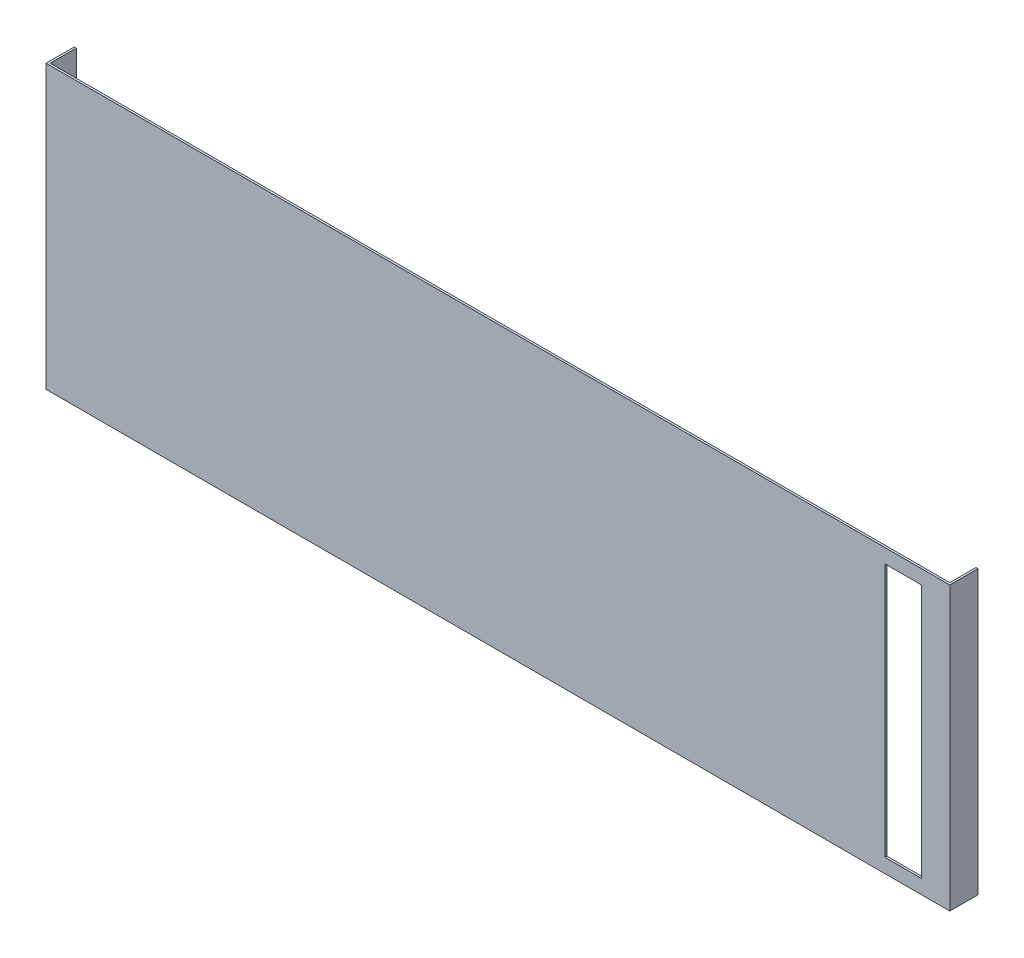
ISO-10303-21;
HEADER;
FILE_DESCRIPTION(('STEP AP214'),'2;1');
FILE_NAME('part.step','',(''),(''),'','','');
FILE_SCHEMA(('AUTOMOTIVE_DESIGN { 1 0 10303 214 1 1 1 1 }'));
ENDSEC;
DATA;
#1=APPLICATION_CONTEXT('core data for automotive mechanical design processes');
#2=APPLICATION_PROTOCOL_DEFINITION('international standard','automotive_design',2000,#1);
#3=PRODUCT_CONTEXT('',#1,'mechanical');
#4=PRODUCT('Part','Part','',(#3));
#5=PRODUCT_RELATED_PRODUCT_CATEGORY('part','',(#4));
#6=PRODUCT_DEFINITION_FORMATION('','',#4);
#7=PRODUCT_DEFINITION_CONTEXT('part definition',#1,'design');
#8=PRODUCT_DEFINITION('design','',#6,#7);
#9=PRODUCT_DEFINITION_SHAPE('','',#8);
#10=(LENGTH_UNIT() NAMED_UNIT(*) SI_UNIT(.MILLI.,.METRE.));
#11=(NAMED_UNIT(*) PLANE_ANGLE_UNIT() SI_UNIT($,.RADIAN.));
#12=(NAMED_UNIT(*) SI_UNIT($,.STERADIAN.) SOLID_ANGLE_UNIT());
#13=UNCERTAINTY_MEASURE_WITH_UNIT(LENGTH_MEASURE(1.E-05),#10,'distance_accuracy_value','');
#14=(GEOMETRIC_REPRESENTATION_CONTEXT(3) GLOBAL_UNCERTAINTY_ASSIGNED_CONTEXT((#13)) GLOBAL_UNIT_ASSIGNED_CONTEXT((#10,
#11,#12)) REPRESENTATION_CONTEXT('',''));
#15=CARTESIAN_POINT('',(0.,0.,0.));
#16=DIRECTION('',(0.,0.,1.));
#17=DIRECTION('',(1.,0.,0.));
#18=AXIS2_PLACEMENT_3D('',#15,#16,#17);
#19=CARTESIAN_POINT('',(670.,320.,40.));
#20=DIRECTION('',(0.,0.,-1.));
#21=DIRECTION('',(-1.,0.,0.));
#22=AXIS2_PLACEMENT_3D('',#19,#20,#21);
#23=PLANE('',#22);
#24=DIRECTION('',(1.,0.,0.));
#25=VECTOR('',#24,1.);
#26=CARTESIAN_POINT('',(670.,120.,40.));
#27=LINE('',#26,#25);
#28=CARTESIAN_POINT('',(30.,120.,40.));
#29=VERTEX_POINT('',#28);
#30=CARTESIAN_POINT('',(670.,120.,40.));
#31=VERTEX_POINT('',#30);
#32=EDGE_CURVE('E141',#29,#31,#27,.T.);
#33=ORIENTED_EDGE('',*,*,#32,.T.);
#34=DIRECTION('',(0.,-1.,0.));
#35=VECTOR('',#34,1.);
#36=CARTESIAN_POINT('',(670.,320.,40.));
#37=LINE('',#36,#35);
#38=CARTESIAN_POINT('',(670.,320.,40.));
#39=VERTEX_POINT('',#38);
#40=EDGE_CURVE('E200',#39,#31,#37,.T.);
#41=ORIENTED_EDGE('',*,*,#40,.F.);
#42=DIRECTION('',(1.,0.,0.));
#43=VECTOR('',#42,1.);
#44=CARTESIAN_POINT('',(670.,320.,40.));
#45=LINE('',#44,#43);
#46=CARTESIAN_POINT('',(30.,320.,40.));
#47=VERTEX_POINT('',#46);
#48=EDGE_CURVE('E149',#47,#39,#45,.T.);
#49=ORIENTED_EDGE('',*,*,#48,.F.);
#50=DIRECTION('',(0.,-1.,0.));
#51=VECTOR('',#50,1.);
#52=CARTESIAN_POINT('',(30.,320.,40.));
#53=LINE('',#52,#51);
#54=EDGE_CURVE('E166',#47,#29,#53,.T.);
#55=ORIENTED_EDGE('',*,*,#54,.T.);
#56=EDGE_LOOP('',(#33,#41,#49,#55));
#57=FACE_BOUND('',#56,.T.);
#58=DIRECTION('',(0.,-1.,0.));
#59=VECTOR('',#58,1.);
#60=CARTESIAN_POINT('',(624.,320.,40.));
#61=LINE('',#60,#59);
#62=CARTESIAN_POINT('',(624.,310.,40.));
#63=VERTEX_POINT('',#62);
#64=CARTESIAN_POINT('',(624.,130.,40.));
#65=VERTEX_POINT('',#64);
#66=EDGE_CURVE('E134',#63,#65,#61,.T.);
#67=ORIENTED_EDGE('',*,*,#66,.F.);
#68=DIRECTION('',(-1.,0.,0.));
#69=VECTOR('',#68,1.);
#70=CARTESIAN_POINT('',(670.,310.,40.));
#71=LINE('',#70,#69);
#72=CARTESIAN_POINT('',(650.,310.,40.));
#73=VERTEX_POINT('',#72);
#74=EDGE_CURVE('E123',#73,#63,#71,.T.);
#75=ORIENTED_EDGE('',*,*,#74,.F.);
#76=DIRECTION('',(0.,1.,0.));
#77=VECTOR('',#76,1.);
#78=CARTESIAN_POINT('',(650.,320.,40.));
#79=LINE('',#78,#77);
#80=CARTESIAN_POINT('',(650.,130.,40.));
#81=VERTEX_POINT('',#80);
#82=EDGE_CURVE('E128',#81,#73,#79,.T.);
#83=ORIENTED_EDGE('',*,*,#82,.F.);
#84=DIRECTION('',(1.,0.,0.));
#85=VECTOR('',#84,1.);
#86=CARTESIAN_POINT('',(670.,130.,40.));
#87=LINE('',#86,#85);
#88=EDGE_CURVE('E140',#65,#81,#87,.T.);
#89=ORIENTED_EDGE('',*,*,#88,.F.);
#90=EDGE_LOOP('',(#67,#75,#83,#89));
#91=FACE_BOUND('',#90,.T.);
#92=ADVANCED_FACE('F39',(#57,#91),#23,.F.);
#93=CARTESIAN_POINT('',(31.5,320.,38.5));
#94=DIRECTION('',(0.,0.,1.));
#95=DIRECTION('',(1.,0.,0.));
#96=AXIS2_PLACEMENT_3D('',#93,#94,#95);
#97=PLANE('',#96);
#98=DIRECTION('',(-1.,0.,0.));
#99=VECTOR('',#98,1.);
#100=CARTESIAN_POINT('',(31.5,120.,38.5));
#101=LINE('',#100,#99);
#102=CARTESIAN_POINT('',(668.5,120.,38.5));
#103=VERTEX_POINT('',#102);
#104=CARTESIAN_POINT('',(31.5,120.,38.5));
#105=VERTEX_POINT('',#104);
#106=EDGE_CURVE('E173',#103,#105,#101,.T.);
#107=ORIENTED_EDGE('',*,*,#106,.T.);
#108=DIRECTION('',(0.,-1.,0.));
#109=VECTOR('',#108,1.);
#110=CARTESIAN_POINT('',(31.5,320.,38.5));
#111=LINE('',#110,#109);
#112=CARTESIAN_POINT('',(31.5,320.,38.5));
#113=VERTEX_POINT('',#112);
#114=EDGE_CURVE('E188',#113,#105,#111,.T.);
#115=ORIENTED_EDGE('',*,*,#114,.F.);
#116=DIRECTION('',(-1.,0.,0.));
#117=VECTOR('',#116,1.);
#118=CARTESIAN_POINT('',(31.5,320.,38.5));
#119=LINE('',#118,#117);
#120=CARTESIAN_POINT('',(668.5,320.,38.5));
#121=VERTEX_POINT('',#120);
#122=EDGE_CURVE('E159',#121,#113,#119,.T.);
#123=ORIENTED_EDGE('',*,*,#122,.F.);
#124=DIRECTION('',(0.,-1.,0.));
#125=VECTOR('',#124,1.);
#126=CARTESIAN_POINT('',(668.5,320.,38.5));
#127=LINE('',#126,#125);
#128=EDGE_CURVE('E191',#121,#103,#127,.T.);
#129=ORIENTED_EDGE('',*,*,#128,.T.);
#130=EDGE_LOOP('',(#107,#115,#123,#129));
#131=FACE_BOUND('',#130,.T.);
#132=DIRECTION('',(0.,1.,0.));
#133=VECTOR('',#132,1.);
#134=CARTESIAN_POINT('',(624.,320.,38.5));
#135=LINE('',#134,#133);
#136=CARTESIAN_POINT('',(624.,130.,38.5));
#137=VERTEX_POINT('',#136);
#138=CARTESIAN_POINT('',(624.,310.,38.5));
#139=VERTEX_POINT('',#138);
#140=EDGE_CURVE('E11',#137,#139,#135,.T.);
#141=ORIENTED_EDGE('',*,*,#140,.F.);
#142=DIRECTION('',(-1.,0.,0.));
#143=VECTOR('',#142,1.);
#144=CARTESIAN_POINT('',(31.5,130.,38.5));
#145=LINE('',#144,#143);
#146=CARTESIAN_POINT('',(650.,130.,38.5));
#147=VERTEX_POINT('',#146);
#148=EDGE_CURVE('E46',#147,#137,#145,.T.);
#149=ORIENTED_EDGE('',*,*,#148,.F.);
#150=DIRECTION('',(0.,-1.,0.));
#151=VECTOR('',#150,1.);
#152=CARTESIAN_POINT('',(650.,320.,38.5));
#153=LINE('',#152,#151);
#154=CARTESIAN_POINT('',(650.,310.,38.5));
#155=VERTEX_POINT('',#154);
#156=EDGE_CURVE('E205',#155,#147,#153,.T.);
#157=ORIENTED_EDGE('',*,*,#156,.F.);
#158=DIRECTION('',(1.,0.,0.));
#159=VECTOR('',#158,1.);
#160=CARTESIAN_POINT('',(31.5,310.,38.5));
#161=LINE('',#160,#159);
#162=EDGE_CURVE('E203',#139,#155,#161,.T.);
#163=ORIENTED_EDGE('',*,*,#162,.F.);
#164=EDGE_LOOP('',(#141,#149,#157,#163));
#165=FACE_BOUND('',#164,.T.);
#166=ADVANCED_FACE('F215',(#131,#165),#97,.F.);
#167=CARTESIAN_POINT('',(670.,320.,20.));
#168=DIRECTION('',(-1.,0.,0.));
#169=DIRECTION('',(0.,0.,1.));
#170=AXIS2_PLACEMENT_3D('',#167,#168,#169);
#171=PLANE('',#170);
#172=DIRECTION('',(0.,0.,-1.));
#173=VECTOR('',#172,1.);
#174=CARTESIAN_POINT('',(670.,120.,20.));
#175=LINE('',#174,#173);
#176=CARTESIAN_POINT('',(670.,120.,20.));
#177=VERTEX_POINT('',#176);
#178=EDGE_CURVE('E144',#31,#177,#175,.T.);
#179=ORIENTED_EDGE('',*,*,#178,.T.);
#180=DIRECTION('',(0.,-1.,0.));
#181=VECTOR('',#180,1.);
#182=CARTESIAN_POINT('',(670.,320.,20.));
#183=LINE('',#182,#181);
#184=CARTESIAN_POINT('',(670.,320.,20.));
#185=VERTEX_POINT('',#184);
#186=EDGE_CURVE('E197',#185,#177,#183,.T.);
#187=ORIENTED_EDGE('',*,*,#186,.F.);
#188=DIRECTION('',(0.,0.,-1.));
#189=VECTOR('',#188,1.);
#190=CARTESIAN_POINT('',(670.,320.,20.));
#191=LINE('',#190,#189);
#192=EDGE_CURVE('E152',#39,#185,#191,.T.);
#193=ORIENTED_EDGE('',*,*,#192,.F.);
#194=ORIENTED_EDGE('',*,*,#40,.T.);
#195=EDGE_LOOP('',(#179,#187,#193,#194));
#196=FACE_BOUND('',#195,.T.);
#197=ADVANCED_FACE('F234',(#196),#171,.F.);
#198=CARTESIAN_POINT('',(668.5,320.,20.));
#199=DIRECTION('',(0.,0.,1.));
#200=DIRECTION('',(1.,0.,0.));
#201=AXIS2_PLACEMENT_3D('',#198,#199,#200);
#202=PLANE('',#201);
#203=DIRECTION('',(-1.,0.,0.));
#204=VECTOR('',#203,1.);
#205=CARTESIAN_POINT('',(668.5,120.,20.));
#206=LINE('',#205,#204);
#207=CARTESIAN_POINT('',(668.5,120.,20.));
#208=VERTEX_POINT('',#207);
#209=EDGE_CURVE('E169',#177,#208,#206,.T.);
#210=ORIENTED_EDGE('',*,*,#209,.T.);
#211=DIRECTION('',(0.,-1.,0.));
#212=VECTOR('',#211,1.);
#213=CARTESIAN_POINT('',(668.5,320.,20.));
#214=LINE('',#213,#212);
#215=CARTESIAN_POINT('',(668.5,320.,20.));
#216=VERTEX_POINT('',#215);
#217=EDGE_CURVE('E194',#216,#208,#214,.T.);
#218=ORIENTED_EDGE('',*,*,#217,.F.);
#219=DIRECTION('',(-1.,0.,0.));
#220=VECTOR('',#219,1.);
#221=CARTESIAN_POINT('',(668.5,320.,20.));
#222=LINE('',#221,#220);
#223=EDGE_CURVE('E155',#185,#216,#222,.T.);
#224=ORIENTED_EDGE('',*,*,#223,.F.);
#225=ORIENTED_EDGE('',*,*,#186,.T.);
#226=EDGE_LOOP('',(#210,#218,#224,#225));
#227=FACE_BOUND('',#226,.T.);
#228=ADVANCED_FACE('F273',(#227),#202,.F.);
#229=CARTESIAN_POINT('',(668.5,320.,38.5));
#230=DIRECTION('',(1.,0.,0.));
#231=DIRECTION('',(0.,0.,-1.));
#232=AXIS2_PLACEMENT_3D('',#229,#230,#231);
#233=PLANE('',#232);
#234=DIRECTION('',(0.,0.,1.));
#235=VECTOR('',#234,1.);
#236=CARTESIAN_POINT('',(668.5,120.,38.5));
#237=LINE('',#236,#235);
#238=EDGE_CURVE('E171',#208,#103,#237,.T.);
#239=ORIENTED_EDGE('',*,*,#238,.T.);
#240=ORIENTED_EDGE('',*,*,#128,.F.);
#241=DIRECTION('',(0.,0.,1.));
#242=VECTOR('',#241,1.);
#243=CARTESIAN_POINT('',(668.5,320.,38.5));
#244=LINE('',#243,#242);
#245=EDGE_CURVE('E157',#216,#121,#244,.T.);
#246=ORIENTED_EDGE('',*,*,#245,.F.);
#247=ORIENTED_EDGE('',*,*,#217,.T.);
#248=EDGE_LOOP('',(#239,#240,#246,#247));
#249=FACE_BOUND('',#248,.T.);
#250=ADVANCED_FACE('F270',(#249),#233,.F.);
#251=CARTESIAN_POINT('',(31.5,320.,20.));
#252=DIRECTION('',(-1.,0.,0.));
#253=DIRECTION('',(0.,0.,1.));
#254=AXIS2_PLACEMENT_3D('',#251,#252,#253);
#255=PLANE('',#254);
#256=DIRECTION('',(0.,0.,-1.));
#257=VECTOR('',#256,1.);
#258=CARTESIAN_POINT('',(31.5,120.,20.));
#259=LINE('',#258,#257);
#260=CARTESIAN_POINT('',(31.5,120.,20.));
#261=VERTEX_POINT('',#260);
#262=EDGE_CURVE('E175',#105,#261,#259,.T.);
#263=ORIENTED_EDGE('',*,*,#262,.T.);
#264=DIRECTION('',(0.,-1.,0.));
#265=VECTOR('',#264,1.);
#266=CARTESIAN_POINT('',(31.5,320.,20.));
#267=LINE('',#266,#265);
#268=CARTESIAN_POINT('',(31.5,320.,20.));
#269=VERTEX_POINT('',#268);
#270=EDGE_CURVE('E185',#269,#261,#267,.T.);
#271=ORIENTED_EDGE('',*,*,#270,.F.);
#272=DIRECTION('',(0.,0.,-1.));
#273=VECTOR('',#272,1.);
#274=CARTESIAN_POINT('',(31.5,320.,20.));
#275=LINE('',#274,#273);
#276=EDGE_CURVE('E161',#113,#269,#275,.T.);
#277=ORIENTED_EDGE('',*,*,#276,.F.);
#278=ORIENTED_EDGE('',*,*,#114,.T.);
#279=EDGE_LOOP('',(#263,#271,#277,#278));
#280=FACE_BOUND('',#279,.T.);
#281=ADVANCED_FACE('F263',(#280),#255,.F.);
#282=CARTESIAN_POINT('',(30.,320.,20.));
#283=DIRECTION('',(0.,0.,1.));
#284=DIRECTION('',(1.,0.,0.));
#285=AXIS2_PLACEMENT_3D('',#282,#283,#284);
#286=PLANE('',#285);
#287=DIRECTION('',(-1.,0.,0.));
#288=VECTOR('',#287,1.);
#289=CARTESIAN_POINT('',(30.,120.,20.));
#290=LINE('',#289,#288);
#291=CARTESIAN_POINT('',(30.,120.,20.));
#292=VERTEX_POINT('',#291);
#293=EDGE_CURVE('E177',#261,#292,#290,.T.);
#294=ORIENTED_EDGE('',*,*,#293,.T.);
#295=DIRECTION('',(0.,-1.,0.));
#296=VECTOR('',#295,1.);
#297=CARTESIAN_POINT('',(30.,320.,20.));
#298=LINE('',#297,#296);
#299=CARTESIAN_POINT('',(30.,320.,20.));
#300=VERTEX_POINT('',#299);
#301=EDGE_CURVE('E182',#300,#292,#298,.T.);
#302=ORIENTED_EDGE('',*,*,#301,.F.);
#303=DIRECTION('',(-1.,0.,0.));
#304=VECTOR('',#303,1.);
#305=CARTESIAN_POINT('',(30.,320.,20.));
#306=LINE('',#305,#304);
#307=EDGE_CURVE('E163',#269,#300,#306,.T.);
#308=ORIENTED_EDGE('',*,*,#307,.F.);
#309=ORIENTED_EDGE('',*,*,#270,.T.);
#310=EDGE_LOOP('',(#294,#302,#308,#309));
#311=FACE_BOUND('',#310,.T.);
#312=ADVANCED_FACE('F258',(#311),#286,.F.);
#313=CARTESIAN_POINT('',(30.,320.,40.));
#314=DIRECTION('',(1.,0.,0.));
#315=DIRECTION('',(0.,0.,-1.));
#316=AXIS2_PLACEMENT_3D('',#313,#314,#315);
#317=PLANE('',#316);
#318=DIRECTION('',(0.,0.,1.));
#319=VECTOR('',#318,1.);
#320=CARTESIAN_POINT('',(30.,120.,40.));
#321=LINE('',#320,#319);
#322=EDGE_CURVE('E153',#292,#29,#321,.T.);
#323=ORIENTED_EDGE('',*,*,#322,.T.);
#324=ORIENTED_EDGE('',*,*,#54,.F.);
#325=DIRECTION('',(0.,0.,1.));
#326=VECTOR('',#325,1.);
#327=CARTESIAN_POINT('',(30.,320.,40.));
#328=LINE('',#327,#326);
#329=EDGE_CURVE('E165',#300,#47,#328,.T.);
#330=ORIENTED_EDGE('',*,*,#329,.F.);
#331=ORIENTED_EDGE('',*,*,#301,.T.);
#332=EDGE_LOOP('',(#323,#324,#330,#331));
#333=FACE_BOUND('',#332,.T.);
#334=ADVANCED_FACE('F256',(#333),#317,.F.);
#335=CARTESIAN_POINT('',(0.,320.,0.));
#336=DIRECTION('',(0.,-1.,0.));
#337=DIRECTION('',(0.,0.,-1.));
#338=AXIS2_PLACEMENT_3D('',#335,#336,#337);
#339=PLANE('',#338);
#340=ORIENTED_EDGE('',*,*,#48,.T.);
#341=ORIENTED_EDGE('',*,*,#192,.T.);
#342=ORIENTED_EDGE('',*,*,#223,.T.);
#343=ORIENTED_EDGE('',*,*,#245,.T.);
#344=ORIENTED_EDGE('',*,*,#122,.T.);
#345=ORIENTED_EDGE('',*,*,#276,.T.);
#346=ORIENTED_EDGE('',*,*,#307,.T.);
#347=ORIENTED_EDGE('',*,*,#329,.T.);
#348=EDGE_LOOP('',(#340,#341,#342,#343,#344,#345,#346,#347));
#349=FACE_BOUND('',#348,.T.);
#350=ADVANCED_FACE('F251',(#349),#339,.F.);
#351=CARTESIAN_POINT('',(0.,120.,0.));
#352=DIRECTION('',(0.,-1.,0.));
#353=DIRECTION('',(0.,0.,-1.));
#354=AXIS2_PLACEMENT_3D('',#351,#352,#353);
#355=PLANE('',#354);
#356=ORIENTED_EDGE('',*,*,#32,.F.);
#357=ORIENTED_EDGE('',*,*,#322,.F.);
#358=ORIENTED_EDGE('',*,*,#293,.F.);
#359=ORIENTED_EDGE('',*,*,#262,.F.);
#360=ORIENTED_EDGE('',*,*,#106,.F.);
#361=ORIENTED_EDGE('',*,*,#238,.F.);
#362=ORIENTED_EDGE('',*,*,#209,.F.);
#363=ORIENTED_EDGE('',*,*,#178,.F.);
#364=EDGE_LOOP('',(#356,#357,#358,#359,#360,#361,#362,#363));
#365=FACE_BOUND('',#364,.T.);
#366=ADVANCED_FACE('F243',(#365),#355,.T.);
#367=CARTESIAN_POINT('',(624.,130.,41.));
#368=DIRECTION('',(1.,0.,0.));
#369=DIRECTION('',(0.,0.,-1.));
#370=AXIS2_PLACEMENT_3D('',#367,#368,#369);
#371=PLANE('',#370);
#372=ORIENTED_EDGE('',*,*,#66,.T.);
#373=DIRECTION('',(0.,0.,-1.));
#374=VECTOR('',#373,1.);
#375=CARTESIAN_POINT('',(624.,130.,41.));
#376=LINE('',#375,#374);
#377=EDGE_CURVE('E129',#65,#137,#376,.T.);
#378=ORIENTED_EDGE('',*,*,#377,.T.);
#379=ORIENTED_EDGE('',*,*,#140,.T.);
#380=DIRECTION('',(0.,0.,-1.));
#381=VECTOR('',#380,1.);
#382=CARTESIAN_POINT('',(624.,310.,41.));
#383=LINE('',#382,#381);
#384=EDGE_CURVE('E58',#63,#139,#383,.T.);
#385=ORIENTED_EDGE('',*,*,#384,.F.);
#386=EDGE_LOOP('',(#372,#378,#379,#385));
#387=FACE_BOUND('',#386,.T.);
#388=ADVANCED_FACE('F132',(#387),#371,.T.);
#389=CARTESIAN_POINT('',(624.,130.,41.));
#390=DIRECTION('',(0.,1.,0.));
#391=DIRECTION('',(0.,0.,1.));
#392=AXIS2_PLACEMENT_3D('',#389,#390,#391);
#393=PLANE('',#392);
#394=ORIENTED_EDGE('',*,*,#88,.T.);
#395=DIRECTION('',(0.,0.,-1.));
#396=VECTOR('',#395,1.);
#397=CARTESIAN_POINT('',(650.,130.,41.));
#398=LINE('',#397,#396);
#399=EDGE_CURVE('E211',#81,#147,#398,.T.);
#400=ORIENTED_EDGE('',*,*,#399,.T.);
#401=ORIENTED_EDGE('',*,*,#148,.T.);
#402=ORIENTED_EDGE('',*,*,#377,.F.);
#403=EDGE_LOOP('',(#394,#400,#401,#402));
#404=FACE_BOUND('',#403,.T.);
#405=ADVANCED_FACE('F209',(#404),#393,.T.);
#406=CARTESIAN_POINT('',(650.,130.,41.));
#407=DIRECTION('',(-1.,0.,0.));
#408=DIRECTION('',(0.,0.,1.));
#409=AXIS2_PLACEMENT_3D('',#406,#407,#408);
#410=PLANE('',#409);
#411=ORIENTED_EDGE('',*,*,#82,.T.);
#412=DIRECTION('',(0.,0.,-1.));
#413=VECTOR('',#412,1.);
#414=CARTESIAN_POINT('',(650.,310.,41.));
#415=LINE('',#414,#413);
#416=EDGE_CURVE('E53',#73,#155,#415,.T.);
#417=ORIENTED_EDGE('',*,*,#416,.T.);
#418=ORIENTED_EDGE('',*,*,#156,.T.);
#419=ORIENTED_EDGE('',*,*,#399,.F.);
#420=EDGE_LOOP('',(#411,#417,#418,#419));
#421=FACE_BOUND('',#420,.T.);
#422=ADVANCED_FACE('F217',(#421),#410,.T.);
#423=CARTESIAN_POINT('',(624.,310.,41.));
#424=DIRECTION('',(0.,-1.,0.));
#425=DIRECTION('',(0.,0.,-1.));
#426=AXIS2_PLACEMENT_3D('',#423,#424,#425);
#427=PLANE('',#426);
#428=ORIENTED_EDGE('',*,*,#74,.T.);
#429=ORIENTED_EDGE('',*,*,#384,.T.);
#430=ORIENTED_EDGE('',*,*,#162,.T.);
#431=ORIENTED_EDGE('',*,*,#416,.F.);
#432=EDGE_LOOP('',(#428,#429,#430,#431));
#433=FACE_BOUND('',#432,.T.);
#434=ADVANCED_FACE('F124',(#433),#427,.T.);
#435=CLOSED_SHELL('',(#92,#166,#197,#228,#250,#281,#312,#334,#350,#366,#388,#405,#422,#434));
#436=MANIFOLD_SOLID_BREP('B2',#435);
#437=ADVANCED_BREP_SHAPE_REPRESENTATION('',(#18,#436),#14);
#438=SHAPE_DEFINITION_REPRESENTATION(#9,#437);
ENDSEC;
END-ISO-10303-21;
